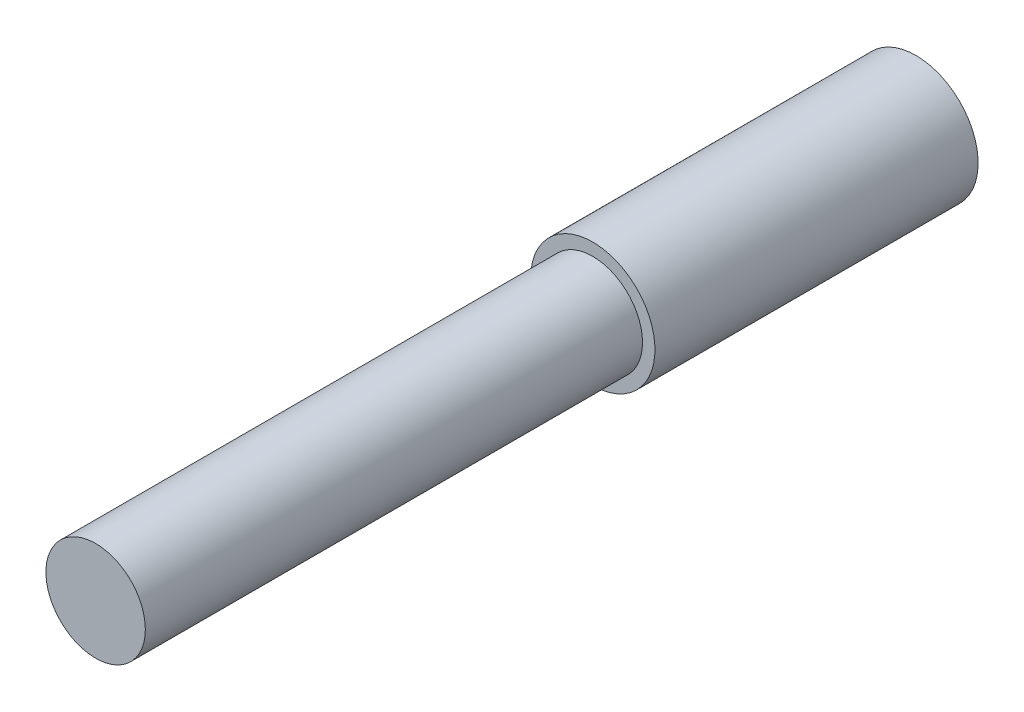
ISO-10303-21;
HEADER;
FILE_DESCRIPTION(('STEP AP214'),'2;1');
FILE_NAME('part.step','',(''),(''),'','','');
FILE_SCHEMA(('AUTOMOTIVE_DESIGN { 1 0 10303 214 1 1 1 1 }'));
ENDSEC;
DATA;
#1=APPLICATION_CONTEXT('core data for automotive mechanical design processes');
#2=APPLICATION_PROTOCOL_DEFINITION('international standard','automotive_design',2000,#1);
#3=PRODUCT_CONTEXT('',#1,'mechanical');
#4=PRODUCT('Part','Part','',(#3));
#5=PRODUCT_RELATED_PRODUCT_CATEGORY('part','',(#4));
#6=PRODUCT_DEFINITION_FORMATION('','',#4);
#7=PRODUCT_DEFINITION_CONTEXT('part definition',#1,'design');
#8=PRODUCT_DEFINITION('design','',#6,#7);
#9=PRODUCT_DEFINITION_SHAPE('','',#8);
#10=(LENGTH_UNIT() NAMED_UNIT(*) SI_UNIT(.MILLI.,.METRE.));
#11=(NAMED_UNIT(*) PLANE_ANGLE_UNIT() SI_UNIT($,.RADIAN.));
#12=(NAMED_UNIT(*) SI_UNIT($,.STERADIAN.) SOLID_ANGLE_UNIT());
#13=UNCERTAINTY_MEASURE_WITH_UNIT(LENGTH_MEASURE(1.E-05),#10,'distance_accuracy_value','');
#14=(GEOMETRIC_REPRESENTATION_CONTEXT(3) GLOBAL_UNCERTAINTY_ASSIGNED_CONTEXT((#13)) GLOBAL_UNIT_ASSIGNED_CONTEXT((#10,
#11,#12)) REPRESENTATION_CONTEXT('',''));
#15=CARTESIAN_POINT('',(0.,0.,0.));
#16=DIRECTION('',(0.,0.,1.));
#17=DIRECTION('',(1.,0.,0.));
#18=AXIS2_PLACEMENT_3D('',#15,#16,#17);
#19=CARTESIAN_POINT('',(0.,0.,13.));
#20=DIRECTION('',(0.,0.,-1.));
#21=DIRECTION('',(-1.,0.,0.));
#22=AXIS2_PLACEMENT_3D('',#19,#20,#21);
#23=CYLINDRICAL_SURFACE('',#22,2.5);
#24=CARTESIAN_POINT('',(0.,0.,13.));
#25=DIRECTION('',(0.,0.,1.));
#26=DIRECTION('',(1.,0.,0.));
#27=AXIS2_PLACEMENT_3D('',#24,#25,#26);
#28=CIRCLE('',#27,2.5);
#29=CARTESIAN_POINT('',(-2.5,0.,13.));
#30=VERTEX_POINT('',#29);
#31=EDGE_CURVE('E10',#30,#30,#28,.T.);
#32=CARTESIAN_POINT('',(0.,0.,0.));
#33=DIRECTION('',(0.,0.,1.));
#34=DIRECTION('',(1.,0.,0.));
#35=AXIS2_PLACEMENT_3D('',#32,#33,#34);
#36=CIRCLE('',#35,2.5);
#37=CARTESIAN_POINT('',(-2.5,0.,0.));
#38=VERTEX_POINT('',#37);
#39=EDGE_CURVE('E34',#38,#38,#36,.T.);
#40=CARTESIAN_POINT('',(-2.5,0.,13.));
#41=CARTESIAN_POINT('',(-2.5,0.,12.8645833333333));
#42=CARTESIAN_POINT('',(-2.5,0.,12.7291666666667));
#43=CARTESIAN_POINT('',(-2.5,0.,12.4583333333333));
#44=CARTESIAN_POINT('',(-2.5,0.,12.3229166666667));
#45=CARTESIAN_POINT('',(-2.5,0.,12.0520833333333));
#46=CARTESIAN_POINT('',(-2.5,0.,11.9166666666667));
#47=CARTESIAN_POINT('',(-2.5,0.,11.6458333333333));
#48=CARTESIAN_POINT('',(-2.5,0.,11.5104166666667));
#49=CARTESIAN_POINT('',(-2.5,0.,11.2395833333333));
#50=CARTESIAN_POINT('',(-2.5,0.,11.1041666666667));
#51=CARTESIAN_POINT('',(-2.5,0.,10.8333333333333));
#52=CARTESIAN_POINT('',(-2.5,0.,10.6979166666667));
#53=CARTESIAN_POINT('',(-2.5,0.,10.4270833333333));
#54=CARTESIAN_POINT('',(-2.5,0.,10.2916666666667));
#55=CARTESIAN_POINT('',(-2.5,0.,10.0208333333333));
#56=CARTESIAN_POINT('',(-2.5,0.,9.88541666666667));
#57=CARTESIAN_POINT('',(-2.5,0.,9.61458333333333));
#58=CARTESIAN_POINT('',(-2.5,0.,9.47916666666667));
#59=CARTESIAN_POINT('',(-2.5,0.,9.20833333333333));
#60=CARTESIAN_POINT('',(-2.5,0.,9.07291666666667));
#61=CARTESIAN_POINT('',(-2.5,0.,8.80208333333333));
#62=CARTESIAN_POINT('',(-2.5,0.,8.66666666666667));
#63=CARTESIAN_POINT('',(-2.5,0.,8.39583333333333));
#64=CARTESIAN_POINT('',(-2.5,0.,8.26041666666667));
#65=CARTESIAN_POINT('',(-2.5,0.,7.98958333333333));
#66=CARTESIAN_POINT('',(-2.5,0.,7.85416666666667));
#67=CARTESIAN_POINT('',(-2.5,0.,7.58333333333333));
#68=CARTESIAN_POINT('',(-2.5,0.,7.44791666666667));
#69=CARTESIAN_POINT('',(-2.5,0.,7.17708333333333));
#70=CARTESIAN_POINT('',(-2.5,0.,7.04166666666667));
#71=CARTESIAN_POINT('',(-2.5,0.,6.77083333333333));
#72=CARTESIAN_POINT('',(-2.5,0.,6.63541666666667));
#73=CARTESIAN_POINT('',(-2.5,0.,6.36458333333333));
#74=CARTESIAN_POINT('',(-2.5,0.,6.22916666666667));
#75=CARTESIAN_POINT('',(-2.5,0.,5.95833333333333));
#76=CARTESIAN_POINT('',(-2.5,0.,5.82291666666667));
#77=CARTESIAN_POINT('',(-2.5,0.,5.55208333333333));
#78=CARTESIAN_POINT('',(-2.5,0.,5.41666666666667));
#79=CARTESIAN_POINT('',(-2.5,0.,5.14583333333333));
#80=CARTESIAN_POINT('',(-2.5,0.,5.01041666666667));
#81=CARTESIAN_POINT('',(-2.5,0.,4.73958333333333));
#82=CARTESIAN_POINT('',(-2.5,0.,4.60416666666667));
#83=CARTESIAN_POINT('',(-2.5,0.,4.33333333333333));
#84=CARTESIAN_POINT('',(-2.5,0.,4.19791666666667));
#85=CARTESIAN_POINT('',(-2.5,0.,3.92708333333333));
#86=CARTESIAN_POINT('',(-2.5,0.,3.79166666666667));
#87=CARTESIAN_POINT('',(-2.5,0.,3.52083333333333));
#88=CARTESIAN_POINT('',(-2.5,0.,3.38541666666667));
#89=CARTESIAN_POINT('',(-2.5,0.,3.11458333333333));
#90=CARTESIAN_POINT('',(-2.5,0.,2.97916666666667));
#91=CARTESIAN_POINT('',(-2.5,0.,2.70833333333333));
#92=CARTESIAN_POINT('',(-2.5,0.,2.57291666666667));
#93=CARTESIAN_POINT('',(-2.5,0.,2.30208333333333));
#94=CARTESIAN_POINT('',(-2.5,0.,2.16666666666667));
#95=CARTESIAN_POINT('',(-2.5,0.,1.89583333333333));
#96=CARTESIAN_POINT('',(-2.5,0.,1.76041666666667));
#97=CARTESIAN_POINT('',(-2.5,0.,1.48958333333333));
#98=CARTESIAN_POINT('',(-2.5,0.,1.35416666666667));
#99=CARTESIAN_POINT('',(-2.5,0.,1.08333333333333));
#100=CARTESIAN_POINT('',(-2.5,0.,0.947916666666667));
#101=CARTESIAN_POINT('',(-2.5,0.,0.677083333333334));
#102=CARTESIAN_POINT('',(-2.5,0.,0.541666666666667));
#103=CARTESIAN_POINT('',(-2.5,0.,0.270833333333334));
#104=CARTESIAN_POINT('',(-2.5,0.,0.135416666666667));
#105=CARTESIAN_POINT('',(-2.5,0.,0.));
#106=B_SPLINE_CURVE_WITH_KNOTS('',3,(#40,#41,#42,#43,#44,#45,#46,#47,#48,#49,#50,#51,#52,#53,
#54,#55,#56,#57,#58,#59,#60,#61,#62,#63,#64,#65,#66,#67,#68,#69,#70,#71,#72,#73,#74,#75,#76,#77,
#78,#79,#80,#81,#82,#83,#84,#85,#86,#87,#88,#89,#90,#91,#92,#93,#94,#95,#96,#97,#98,#99,#100,
#101,#102,#103,#104,#105),.UNSPECIFIED.,.F.,.F.,(4,2,2,2,2,2,2,2,2,2,2,2,2,2,2,2,2,2,2,2,2,2,2,
2,2,2,2,2,2,2,2,2,4),(0.,0.406249999999999,0.812499999999999,1.21875,1.625,2.03125,2.4375,
2.84375,3.25,3.65625,4.0625,4.46875,4.875,5.28125,5.6875,6.09375,6.5,6.90625,7.3125,7.71875,
8.125,8.53125,8.9375,9.34375,9.75,10.15625,10.5625,10.96875,11.375,11.78125,12.1875,12.59375,
13.),.UNSPECIFIED.);
#107=EDGE_CURVE('BSEAM31',#30,#38,#106,.T.);
#108=ORIENTED_EDGE('',*,*,#31,.F.);
#109=ORIENTED_EDGE('',*,*,#39,.T.);
#110=ORIENTED_EDGE('',*,*,#107,.T.);
#111=ORIENTED_EDGE('',*,*,#107,.F.);
#112=EDGE_LOOP('',(#108,#110,#109,#111));
#113=FACE_BOUND('',#112,.T.);
#114=ADVANCED_FACE('F31',(#113),#23,.T.);
#115=CARTESIAN_POINT('',(0.,0.,13.));
#116=DIRECTION('',(0.,0.,1.));
#117=DIRECTION('',(1.,0.,0.));
#118=AXIS2_PLACEMENT_3D('',#115,#116,#117);
#119=PLANE('',#118);
#120=CARTESIAN_POINT('',(0.,0.,13.));
#121=DIRECTION('',(0.,0.,1.));
#122=DIRECTION('',(1.,0.,0.));
#123=AXIS2_PLACEMENT_3D('',#120,#121,#122);
#124=CIRCLE('',#123,2.);
#125=CARTESIAN_POINT('',(2.,0.,13.));
#126=VERTEX_POINT('',#125);
#127=EDGE_CURVE('E43',#126,#126,#124,.T.);
#128=ORIENTED_EDGE('',*,*,#127,.F.);
#129=EDGE_LOOP('',(#128));
#130=FACE_BOUND('',#129,.T.);
#131=ORIENTED_EDGE('',*,*,#31,.T.);
#132=EDGE_LOOP('',(#131));
#133=FACE_BOUND('',#132,.T.);
#134=ADVANCED_FACE('F58',(#130,#133),#119,.T.);
#135=CARTESIAN_POINT('',(0.,0.,0.));
#136=DIRECTION('',(0.,0.,1.));
#137=DIRECTION('',(1.,0.,0.));
#138=AXIS2_PLACEMENT_3D('',#135,#136,#137);
#139=PLANE('',#138);
#140=ORIENTED_EDGE('',*,*,#39,.F.);
#141=EDGE_LOOP('',(#140));
#142=FACE_BOUND('',#141,.T.);
#143=ADVANCED_FACE('F54',(#142),#139,.F.);
#144=CARTESIAN_POINT('',(0.,0.,33.));
#145=DIRECTION('',(0.,0.,-1.));
#146=DIRECTION('',(-1.,0.,0.));
#147=AXIS2_PLACEMENT_3D('',#144,#145,#146);
#148=CYLINDRICAL_SURFACE('',#147,2.);
#149=CARTESIAN_POINT('',(0.,0.,33.));
#150=DIRECTION('',(0.,0.,1.));
#151=DIRECTION('',(1.,0.,0.));
#152=AXIS2_PLACEMENT_3D('',#149,#150,#151);
#153=CIRCLE('',#152,2.);
#154=CARTESIAN_POINT('',(2.,0.,33.));
#155=VERTEX_POINT('',#154);
#156=EDGE_CURVE('E41',#155,#155,#153,.T.);
#157=ORIENTED_EDGE('',*,*,#156,.F.);
#158=EDGE_LOOP('',(#157));
#159=FACE_BOUND('',#158,.T.);
#160=ORIENTED_EDGE('',*,*,#127,.T.);
#161=EDGE_LOOP('',(#160));
#162=FACE_BOUND('',#161,.T.);
#163=ADVANCED_FACE('F51',(#159,#162),#148,.T.);
#164=CARTESIAN_POINT('',(0.,0.,33.));
#165=DIRECTION('',(0.,0.,1.));
#166=DIRECTION('',(1.,0.,0.));
#167=AXIS2_PLACEMENT_3D('',#164,#165,#166);
#168=PLANE('',#167);
#169=ORIENTED_EDGE('',*,*,#156,.T.);
#170=EDGE_LOOP('',(#169));
#171=FACE_BOUND('',#170,.T.);
#172=ADVANCED_FACE('F49',(#171),#168,.T.);
#173=CLOSED_SHELL('',(#114,#134,#143,#163,#172));
#174=MANIFOLD_SOLID_BREP('B2',#173);
#175=ADVANCED_BREP_SHAPE_REPRESENTATION('',(#18,#174),#14);
#176=SHAPE_DEFINITION_REPRESENTATION(#9,#175);
ENDSEC;
END-ISO-10303-21;
